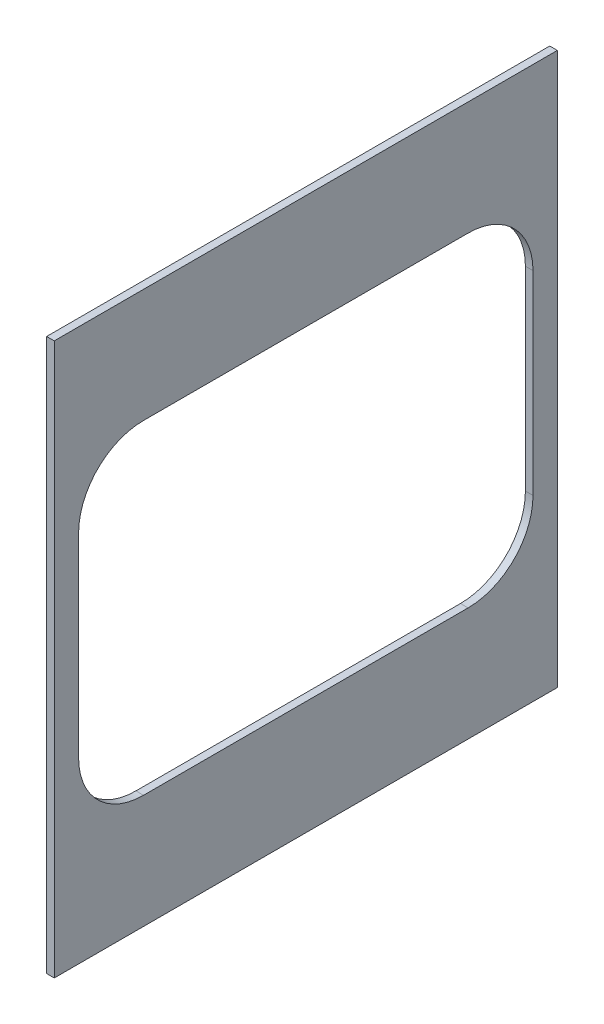
ISO-10303-21;
HEADER;
FILE_DESCRIPTION(('STEP AP214'),'2;1');
FILE_NAME('part.step','',(''),(''),'','','');
FILE_SCHEMA(('AUTOMOTIVE_DESIGN { 1 0 10303 214 1 1 1 1 }'));
ENDSEC;
DATA;
#1=APPLICATION_CONTEXT('core data for automotive mechanical design processes');
#2=APPLICATION_PROTOCOL_DEFINITION('international standard','automotive_design',2000,#1);
#3=PRODUCT_CONTEXT('',#1,'mechanical');
#4=PRODUCT('Part','Part','',(#3));
#5=PRODUCT_RELATED_PRODUCT_CATEGORY('part','',(#4));
#6=PRODUCT_DEFINITION_FORMATION('','',#4);
#7=PRODUCT_DEFINITION_CONTEXT('part definition',#1,'design');
#8=PRODUCT_DEFINITION('design','',#6,#7);
#9=PRODUCT_DEFINITION_SHAPE('','',#8);
#10=(LENGTH_UNIT() NAMED_UNIT(*) SI_UNIT(.MILLI.,.METRE.));
#11=(NAMED_UNIT(*) PLANE_ANGLE_UNIT() SI_UNIT($,.RADIAN.));
#12=(NAMED_UNIT(*) SI_UNIT($,.STERADIAN.) SOLID_ANGLE_UNIT());
#13=UNCERTAINTY_MEASURE_WITH_UNIT(LENGTH_MEASURE(1.E-05),#10,'distance_accuracy_value','');
#14=(GEOMETRIC_REPRESENTATION_CONTEXT(3) GLOBAL_UNCERTAINTY_ASSIGNED_CONTEXT((#13)) GLOBAL_UNIT_ASSIGNED_CONTEXT((#10,
#11,#12)) REPRESENTATION_CONTEXT('',''));
#15=CARTESIAN_POINT('',(0.,0.,0.));
#16=DIRECTION('',(0.,0.,1.));
#17=DIRECTION('',(1.,0.,0.));
#18=AXIS2_PLACEMENT_3D('',#15,#16,#17);
#19=CARTESIAN_POINT('',(11.90625,0.,0.));
#20=DIRECTION('',(-1.,0.,0.));
#21=DIRECTION('',(0.,0.,1.));
#22=AXIS2_PLACEMENT_3D('',#19,#20,#21);
#23=PLANE('',#22);
#24=DIRECTION('',(0.,-1.,0.));
#25=VECTOR('',#24,1.);
#26=CARTESIAN_POINT('',(11.90625,0.,0.));
#27=LINE('',#26,#25);
#28=CARTESIAN_POINT('',(11.90625,863.6,0.));
#29=VERTEX_POINT('',#28);
#30=CARTESIAN_POINT('',(11.90625,0.,0.));
#31=VERTEX_POINT('',#30);
#32=EDGE_CURVE('E194',#29,#31,#27,.T.);
#33=ORIENTED_EDGE('',*,*,#32,.T.);
#34=DIRECTION('',(0.,0.,-1.));
#35=VECTOR('',#34,1.);
#36=CARTESIAN_POINT('',(11.90625,0.,0.));
#37=LINE('',#36,#35);
#38=CARTESIAN_POINT('',(11.90625,0.,-787.4));
#39=VERTEX_POINT('',#38);
#40=EDGE_CURVE('E197',#31,#39,#37,.T.);
#41=ORIENTED_EDGE('',*,*,#40,.T.);
#42=DIRECTION('',(0.,1.,0.));
#43=VECTOR('',#42,1.);
#44=CARTESIAN_POINT('',(11.90625,0.,-787.4));
#45=LINE('',#44,#43);
#46=CARTESIAN_POINT('',(11.90625,863.6,-787.4));
#47=VERTEX_POINT('',#46);
#48=EDGE_CURVE('E200',#39,#47,#45,.T.);
#49=ORIENTED_EDGE('',*,*,#48,.T.);
#50=DIRECTION('',(0.,0.,1.));
#51=VECTOR('',#50,1.);
#52=CARTESIAN_POINT('',(11.90625,863.6,0.));
#53=LINE('',#52,#51);
#54=EDGE_CURVE('E202',#47,#29,#53,.T.);
#55=ORIENTED_EDGE('',*,*,#54,.T.);
#56=EDGE_LOOP('',(#33,#41,#49,#55));
#57=FACE_BOUND('',#56,.T.);
#58=CARTESIAN_POINT('',(11.90625,279.4,-139.7));
#59=DIRECTION('',(1.,0.,0.));
#60=DIRECTION('',(0.,0.,-1.));
#61=AXIS2_PLACEMENT_3D('',#58,#59,#60);
#62=CIRCLE('',#61,101.6);
#63=CARTESIAN_POINT('',(11.90625,279.4,-38.1000000000001));
#64=VERTEX_POINT('',#63);
#65=CARTESIAN_POINT('',(11.90625,177.8,-139.7));
#66=VERTEX_POINT('',#65);
#67=EDGE_CURVE('E129',#64,#66,#62,.T.);
#68=ORIENTED_EDGE('',*,*,#67,.F.);
#69=DIRECTION('',(0.,-1.,0.));
#70=VECTOR('',#69,1.);
#71=CARTESIAN_POINT('',(11.90625,584.2,-38.1000000000001));
#72=LINE('',#71,#70);
#73=CARTESIAN_POINT('',(11.90625,584.2,-38.1000000000001));
#74=VERTEX_POINT('',#73);
#75=EDGE_CURVE('E162',#74,#64,#72,.T.);
#76=ORIENTED_EDGE('',*,*,#75,.F.);
#77=CARTESIAN_POINT('',(11.90625,584.2,-139.7));
#78=DIRECTION('',(1.,0.,0.));
#79=DIRECTION('',(0.,0.,-1.));
#80=AXIS2_PLACEMENT_3D('',#77,#78,#79);
#81=CIRCLE('',#80,101.6);
#82=CARTESIAN_POINT('',(11.90625,685.8,-139.7));
#83=VERTEX_POINT('',#82);
#84=EDGE_CURVE('E160',#83,#74,#81,.T.);
#85=ORIENTED_EDGE('',*,*,#84,.F.);
#86=DIRECTION('',(0.,0.,1.));
#87=VECTOR('',#86,1.);
#88=CARTESIAN_POINT('',(11.90625,685.8,-139.7));
#89=LINE('',#88,#87);
#90=CARTESIAN_POINT('',(11.90625,685.8,-647.7));
#91=VERTEX_POINT('',#90);
#92=EDGE_CURVE('E158',#91,#83,#89,.T.);
#93=ORIENTED_EDGE('',*,*,#92,.F.);
#94=CARTESIAN_POINT('',(11.90625,584.2,-647.7));
#95=DIRECTION('',(1.,0.,0.));
#96=DIRECTION('',(0.,0.,1.));
#97=AXIS2_PLACEMENT_3D('',#94,#95,#96);
#98=CIRCLE('',#97,101.6);
#99=CARTESIAN_POINT('',(11.90625,584.2,-749.3));
#100=VERTEX_POINT('',#99);
#101=EDGE_CURVE('E156',#100,#91,#98,.T.);
#102=ORIENTED_EDGE('',*,*,#101,.F.);
#103=DIRECTION('',(0.,1.,0.));
#104=VECTOR('',#103,1.);
#105=CARTESIAN_POINT('',(11.90625,584.2,-749.3));
#106=LINE('',#105,#104);
#107=CARTESIAN_POINT('',(11.90625,279.4,-749.3));
#108=VERTEX_POINT('',#107);
#109=EDGE_CURVE('E152',#108,#100,#106,.T.);
#110=ORIENTED_EDGE('',*,*,#109,.F.);
#111=CARTESIAN_POINT('',(11.90625,279.4,-647.7));
#112=DIRECTION('',(1.,0.,0.));
#113=DIRECTION('',(0.,0.,-1.));
#114=AXIS2_PLACEMENT_3D('',#111,#112,#113);
#115=CIRCLE('',#114,101.6);
#116=CARTESIAN_POINT('',(11.90625,177.8,-647.7));
#117=VERTEX_POINT('',#116);
#118=EDGE_CURVE('E150',#117,#108,#115,.T.);
#119=ORIENTED_EDGE('',*,*,#118,.F.);
#120=DIRECTION('',(0.,0.,-1.));
#121=VECTOR('',#120,1.);
#122=CARTESIAN_POINT('',(11.90625,177.8,-139.7));
#123=LINE('',#122,#121);
#124=EDGE_CURVE('E137',#66,#117,#123,.T.);
#125=ORIENTED_EDGE('',*,*,#124,.F.);
#126=EDGE_LOOP('',(#68,#76,#85,#93,#102,#110,#119,#125));
#127=FACE_BOUND('',#126,.T.);
#128=ADVANCED_FACE('F40',(#57,#127),#23,.F.);
#129=CARTESIAN_POINT('',(0.,0.,0.));
#130=DIRECTION('',(-1.,0.,0.));
#131=DIRECTION('',(0.,0.,1.));
#132=AXIS2_PLACEMENT_3D('',#129,#130,#131);
#133=PLANE('',#132);
#134=DIRECTION('',(0.,-1.,0.));
#135=VECTOR('',#134,1.);
#136=CARTESIAN_POINT('',(0.,0.,0.));
#137=LINE('',#136,#135);
#138=CARTESIAN_POINT('',(0.,863.6,0.));
#139=VERTEX_POINT('',#138);
#140=CARTESIAN_POINT('',(0.,0.,0.));
#141=VERTEX_POINT('',#140);
#142=EDGE_CURVE('E145',#139,#141,#137,.T.);
#143=ORIENTED_EDGE('',*,*,#142,.F.);
#144=DIRECTION('',(0.,0.,1.));
#145=VECTOR('',#144,1.);
#146=CARTESIAN_POINT('',(0.,863.6,0.));
#147=LINE('',#146,#145);
#148=CARTESIAN_POINT('',(0.,863.6,-787.4));
#149=VERTEX_POINT('',#148);
#150=EDGE_CURVE('E198',#149,#139,#147,.T.);
#151=ORIENTED_EDGE('',*,*,#150,.F.);
#152=DIRECTION('',(0.,1.,0.));
#153=VECTOR('',#152,1.);
#154=CARTESIAN_POINT('',(0.,0.,-787.4));
#155=LINE('',#154,#153);
#156=CARTESIAN_POINT('',(0.,0.,-787.4));
#157=VERTEX_POINT('',#156);
#158=EDGE_CURVE('E209',#157,#149,#155,.T.);
#159=ORIENTED_EDGE('',*,*,#158,.F.);
#160=DIRECTION('',(0.,0.,-1.));
#161=VECTOR('',#160,1.);
#162=CARTESIAN_POINT('',(0.,0.,0.));
#163=LINE('',#162,#161);
#164=EDGE_CURVE('E207',#141,#157,#163,.T.);
#165=ORIENTED_EDGE('',*,*,#164,.F.);
#166=EDGE_LOOP('',(#143,#151,#159,#165));
#167=FACE_BOUND('',#166,.T.);
#168=DIRECTION('',(0.,-1.,0.));
#169=VECTOR('',#168,1.);
#170=CARTESIAN_POINT('',(0.,584.2,-38.1000000000001));
#171=LINE('',#170,#169);
#172=CARTESIAN_POINT('',(0.,584.2,-38.1000000000001));
#173=VERTEX_POINT('',#172);
#174=CARTESIAN_POINT('',(0.,279.4,-38.1000000000001));
#175=VERTEX_POINT('',#174);
#176=EDGE_CURVE('E138',#173,#175,#171,.T.);
#177=ORIENTED_EDGE('',*,*,#176,.T.);
#178=CARTESIAN_POINT('',(0.,279.4,-139.7));
#179=DIRECTION('',(1.,0.,0.));
#180=DIRECTION('',(0.,0.,-1.));
#181=AXIS2_PLACEMENT_3D('',#178,#179,#180);
#182=CIRCLE('',#181,101.6);
#183=CARTESIAN_POINT('',(0.,177.8,-139.7));
#184=VERTEX_POINT('',#183);
#185=EDGE_CURVE('E63',#175,#184,#182,.T.);
#186=ORIENTED_EDGE('',*,*,#185,.T.);
#187=DIRECTION('',(0.,0.,-1.));
#188=VECTOR('',#187,1.);
#189=CARTESIAN_POINT('',(0.,177.8,-139.7));
#190=LINE('',#189,#188);
#191=CARTESIAN_POINT('',(0.,177.8,-647.7));
#192=VERTEX_POINT('',#191);
#193=EDGE_CURVE('E144',#184,#192,#190,.T.);
#194=ORIENTED_EDGE('',*,*,#193,.T.);
#195=CARTESIAN_POINT('',(0.,279.4,-647.7));
#196=DIRECTION('',(1.,0.,0.));
#197=DIRECTION('',(0.,0.,-1.));
#198=AXIS2_PLACEMENT_3D('',#195,#196,#197);
#199=CIRCLE('',#198,101.6);
#200=CARTESIAN_POINT('',(0.,279.4,-749.3));
#201=VERTEX_POINT('',#200);
#202=EDGE_CURVE('E166',#192,#201,#199,.T.);
#203=ORIENTED_EDGE('',*,*,#202,.T.);
#204=DIRECTION('',(0.,1.,0.));
#205=VECTOR('',#204,1.);
#206=CARTESIAN_POINT('',(0.,584.2,-749.3));
#207=LINE('',#206,#205);
#208=CARTESIAN_POINT('',(0.,584.2,-749.3));
#209=VERTEX_POINT('',#208);
#210=EDGE_CURVE('E169',#201,#209,#207,.T.);
#211=ORIENTED_EDGE('',*,*,#210,.T.);
#212=CARTESIAN_POINT('',(0.,584.2,-647.7));
#213=DIRECTION('',(1.,0.,0.));
#214=DIRECTION('',(0.,0.,1.));
#215=AXIS2_PLACEMENT_3D('',#212,#213,#214);
#216=CIRCLE('',#215,101.6);
#217=CARTESIAN_POINT('',(0.,685.8,-647.7));
#218=VERTEX_POINT('',#217);
#219=EDGE_CURVE('E172',#209,#218,#216,.T.);
#220=ORIENTED_EDGE('',*,*,#219,.T.);
#221=DIRECTION('',(0.,0.,1.));
#222=VECTOR('',#221,1.);
#223=CARTESIAN_POINT('',(0.,685.8,-139.7));
#224=LINE('',#223,#222);
#225=CARTESIAN_POINT('',(0.,685.8,-139.7));
#226=VERTEX_POINT('',#225);
#227=EDGE_CURVE('E175',#218,#226,#224,.T.);
#228=ORIENTED_EDGE('',*,*,#227,.T.);
#229=CARTESIAN_POINT('',(0.,584.2,-139.7));
#230=DIRECTION('',(1.,0.,0.));
#231=DIRECTION('',(0.,0.,-1.));
#232=AXIS2_PLACEMENT_3D('',#229,#230,#231);
#233=CIRCLE('',#232,101.6);
#234=EDGE_CURVE('E178',#226,#173,#233,.T.);
#235=ORIENTED_EDGE('',*,*,#234,.T.);
#236=EDGE_LOOP('',(#177,#186,#194,#203,#211,#220,#228,#235));
#237=FACE_BOUND('',#236,.T.);
#238=ADVANCED_FACE('F227',(#167,#237),#133,.T.);
#239=CARTESIAN_POINT('',(11.90625,0.,0.));
#240=DIRECTION('',(0.,0.,-1.));
#241=DIRECTION('',(-1.,0.,0.));
#242=AXIS2_PLACEMENT_3D('',#239,#240,#241);
#243=PLANE('',#242);
#244=ORIENTED_EDGE('',*,*,#142,.T.);
#245=DIRECTION('',(-1.,0.,0.));
#246=VECTOR('',#245,1.);
#247=CARTESIAN_POINT('',(11.90625,0.,0.));
#248=LINE('',#247,#246);
#249=EDGE_CURVE('E11',#31,#141,#248,.T.);
#250=ORIENTED_EDGE('',*,*,#249,.F.);
#251=ORIENTED_EDGE('',*,*,#32,.F.);
#252=DIRECTION('',(-1.,0.,0.));
#253=VECTOR('',#252,1.);
#254=CARTESIAN_POINT('',(11.90625,863.6,0.));
#255=LINE('',#254,#253);
#256=EDGE_CURVE('E204',#29,#139,#255,.T.);
#257=ORIENTED_EDGE('',*,*,#256,.T.);
#258=EDGE_LOOP('',(#244,#250,#251,#257));
#259=FACE_BOUND('',#258,.T.);
#260=ADVANCED_FACE('F42',(#259),#243,.F.);
#261=CARTESIAN_POINT('',(11.90625,0.,0.));
#262=DIRECTION('',(0.,1.,0.));
#263=DIRECTION('',(0.,0.,1.));
#264=AXIS2_PLACEMENT_3D('',#261,#262,#263);
#265=PLANE('',#264);
#266=ORIENTED_EDGE('',*,*,#164,.T.);
#267=DIRECTION('',(-1.,0.,0.));
#268=VECTOR('',#267,1.);
#269=CARTESIAN_POINT('',(11.90625,0.,-787.4));
#270=LINE('',#269,#268);
#271=EDGE_CURVE('E48',#39,#157,#270,.T.);
#272=ORIENTED_EDGE('',*,*,#271,.F.);
#273=ORIENTED_EDGE('',*,*,#40,.F.);
#274=ORIENTED_EDGE('',*,*,#249,.T.);
#275=EDGE_LOOP('',(#266,#272,#273,#274));
#276=FACE_BOUND('',#275,.T.);
#277=ADVANCED_FACE('F237',(#276),#265,.F.);
#278=CARTESIAN_POINT('',(11.90625,0.,-787.4));
#279=DIRECTION('',(0.,0.,1.));
#280=DIRECTION('',(1.,0.,0.));
#281=AXIS2_PLACEMENT_3D('',#278,#279,#280);
#282=PLANE('',#281);
#283=ORIENTED_EDGE('',*,*,#158,.T.);
#284=DIRECTION('',(-1.,0.,0.));
#285=VECTOR('',#284,1.);
#286=CARTESIAN_POINT('',(11.90625,863.6,-787.4));
#287=LINE('',#286,#285);
#288=EDGE_CURVE('E214',#47,#149,#287,.T.);
#289=ORIENTED_EDGE('',*,*,#288,.F.);
#290=ORIENTED_EDGE('',*,*,#48,.F.);
#291=ORIENTED_EDGE('',*,*,#271,.T.);
#292=EDGE_LOOP('',(#283,#289,#290,#291));
#293=FACE_BOUND('',#292,.T.);
#294=ADVANCED_FACE('F221',(#293),#282,.F.);
#295=CARTESIAN_POINT('',(11.90625,863.6,0.));
#296=DIRECTION('',(0.,-1.,0.));
#297=DIRECTION('',(0.,0.,-1.));
#298=AXIS2_PLACEMENT_3D('',#295,#296,#297);
#299=PLANE('',#298);
#300=ORIENTED_EDGE('',*,*,#150,.T.);
#301=ORIENTED_EDGE('',*,*,#256,.F.);
#302=ORIENTED_EDGE('',*,*,#54,.F.);
#303=ORIENTED_EDGE('',*,*,#288,.T.);
#304=EDGE_LOOP('',(#300,#301,#302,#303));
#305=FACE_BOUND('',#304,.T.);
#306=ADVANCED_FACE('F231',(#305),#299,.F.);
#307=CARTESIAN_POINT('',(11.90625,279.4,-139.7));
#308=DIRECTION('',(-1.,0.,0.));
#309=DIRECTION('',(0.,0.,1.));
#310=AXIS2_PLACEMENT_3D('',#307,#308,#309);
#311=CYLINDRICAL_SURFACE('',#310,101.6);
#312=ORIENTED_EDGE('',*,*,#185,.F.);
#313=DIRECTION('',(-1.,0.,0.));
#314=VECTOR('',#313,1.);
#315=CARTESIAN_POINT('',(11.90625,279.4,-38.1000000000001));
#316=LINE('',#315,#314);
#317=EDGE_CURVE('E133',#64,#175,#316,.T.);
#318=ORIENTED_EDGE('',*,*,#317,.F.);
#319=ORIENTED_EDGE('',*,*,#67,.T.);
#320=DIRECTION('',(-1.,0.,0.));
#321=VECTOR('',#320,1.);
#322=CARTESIAN_POINT('',(11.90625,177.8,-139.7));
#323=LINE('',#322,#321);
#324=EDGE_CURVE('E132',#66,#184,#323,.T.);
#325=ORIENTED_EDGE('',*,*,#324,.T.);
#326=EDGE_LOOP('',(#312,#318,#319,#325));
#327=FACE_BOUND('',#326,.T.);
#328=ADVANCED_FACE('F131',(#327),#311,.F.);
#329=CARTESIAN_POINT('',(11.90625,177.8,-139.7));
#330=DIRECTION('',(0.,1.,0.));
#331=DIRECTION('',(0.,0.,1.));
#332=AXIS2_PLACEMENT_3D('',#329,#330,#331);
#333=PLANE('',#332);
#334=ORIENTED_EDGE('',*,*,#193,.F.);
#335=ORIENTED_EDGE('',*,*,#324,.F.);
#336=ORIENTED_EDGE('',*,*,#124,.T.);
#337=DIRECTION('',(-1.,0.,0.));
#338=VECTOR('',#337,1.);
#339=CARTESIAN_POINT('',(11.90625,177.8,-647.7));
#340=LINE('',#339,#338);
#341=EDGE_CURVE('E146',#117,#192,#340,.T.);
#342=ORIENTED_EDGE('',*,*,#341,.T.);
#343=EDGE_LOOP('',(#334,#335,#336,#342));
#344=FACE_BOUND('',#343,.T.);
#345=ADVANCED_FACE('F141',(#344),#333,.T.);
#346=CARTESIAN_POINT('',(11.90625,279.4,-647.7));
#347=DIRECTION('',(-1.,0.,0.));
#348=DIRECTION('',(0.,0.,1.));
#349=AXIS2_PLACEMENT_3D('',#346,#347,#348);
#350=CYLINDRICAL_SURFACE('',#349,101.6);
#351=ORIENTED_EDGE('',*,*,#202,.F.);
#352=ORIENTED_EDGE('',*,*,#341,.F.);
#353=ORIENTED_EDGE('',*,*,#118,.T.);
#354=DIRECTION('',(-1.,0.,0.));
#355=VECTOR('',#354,1.);
#356=CARTESIAN_POINT('',(11.90625,279.4,-749.3));
#357=LINE('',#356,#355);
#358=EDGE_CURVE('E191',#108,#201,#357,.T.);
#359=ORIENTED_EDGE('',*,*,#358,.T.);
#360=EDGE_LOOP('',(#351,#352,#353,#359));
#361=FACE_BOUND('',#360,.T.);
#362=ADVANCED_FACE('F260',(#361),#350,.F.);
#363=CARTESIAN_POINT('',(11.90625,584.2,-749.3));
#364=DIRECTION('',(0.,0.,1.));
#365=DIRECTION('',(1.,0.,0.));
#366=AXIS2_PLACEMENT_3D('',#363,#364,#365);
#367=PLANE('',#366);
#368=ORIENTED_EDGE('',*,*,#210,.F.);
#369=ORIENTED_EDGE('',*,*,#358,.F.);
#370=ORIENTED_EDGE('',*,*,#109,.T.);
#371=DIRECTION('',(-1.,0.,0.));
#372=VECTOR('',#371,1.);
#373=CARTESIAN_POINT('',(11.90625,584.2,-749.3));
#374=LINE('',#373,#372);
#375=EDGE_CURVE('E189',#100,#209,#374,.T.);
#376=ORIENTED_EDGE('',*,*,#375,.T.);
#377=EDGE_LOOP('',(#368,#369,#370,#376));
#378=FACE_BOUND('',#377,.T.);
#379=ADVANCED_FACE('F264',(#378),#367,.T.);
#380=CARTESIAN_POINT('',(11.90625,584.2,-647.7));
#381=DIRECTION('',(-1.,0.,0.));
#382=DIRECTION('',(0.,0.,1.));
#383=AXIS2_PLACEMENT_3D('',#380,#381,#382);
#384=CYLINDRICAL_SURFACE('',#383,101.6);
#385=ORIENTED_EDGE('',*,*,#219,.F.);
#386=ORIENTED_EDGE('',*,*,#375,.F.);
#387=ORIENTED_EDGE('',*,*,#101,.T.);
#388=DIRECTION('',(-1.,0.,0.));
#389=VECTOR('',#388,1.);
#390=CARTESIAN_POINT('',(11.90625,685.8,-647.7));
#391=LINE('',#390,#389);
#392=EDGE_CURVE('E187',#91,#218,#391,.T.);
#393=ORIENTED_EDGE('',*,*,#392,.T.);
#394=EDGE_LOOP('',(#385,#386,#387,#393));
#395=FACE_BOUND('',#394,.T.);
#396=ADVANCED_FACE('F270',(#395),#384,.F.);
#397=CARTESIAN_POINT('',(11.90625,685.8,-139.7));
#398=DIRECTION('',(0.,-1.,0.));
#399=DIRECTION('',(0.,0.,-1.));
#400=AXIS2_PLACEMENT_3D('',#397,#398,#399);
#401=PLANE('',#400);
#402=ORIENTED_EDGE('',*,*,#227,.F.);
#403=ORIENTED_EDGE('',*,*,#392,.F.);
#404=ORIENTED_EDGE('',*,*,#92,.T.);
#405=DIRECTION('',(-1.,0.,0.));
#406=VECTOR('',#405,1.);
#407=CARTESIAN_POINT('',(11.90625,685.8,-139.7));
#408=LINE('',#407,#406);
#409=EDGE_CURVE('E185',#83,#226,#408,.T.);
#410=ORIENTED_EDGE('',*,*,#409,.T.);
#411=EDGE_LOOP('',(#402,#403,#404,#410));
#412=FACE_BOUND('',#411,.T.);
#413=ADVANCED_FACE('F274',(#412),#401,.T.);
#414=CARTESIAN_POINT('',(11.90625,584.2,-139.7));
#415=DIRECTION('',(-1.,0.,0.));
#416=DIRECTION('',(0.,0.,1.));
#417=AXIS2_PLACEMENT_3D('',#414,#415,#416);
#418=CYLINDRICAL_SURFACE('',#417,101.6);
#419=ORIENTED_EDGE('',*,*,#234,.F.);
#420=ORIENTED_EDGE('',*,*,#409,.F.);
#421=ORIENTED_EDGE('',*,*,#84,.T.);
#422=DIRECTION('',(-1.,0.,0.));
#423=VECTOR('',#422,1.);
#424=CARTESIAN_POINT('',(11.90625,584.2,-38.1000000000001));
#425=LINE('',#424,#423);
#426=EDGE_CURVE('E55',#74,#173,#425,.T.);
#427=ORIENTED_EDGE('',*,*,#426,.T.);
#428=EDGE_LOOP('',(#419,#420,#421,#427));
#429=FACE_BOUND('',#428,.T.);
#430=ADVANCED_FACE('F278',(#429),#418,.F.);
#431=CARTESIAN_POINT('',(11.90625,584.2,-38.1000000000001));
#432=DIRECTION('',(0.,0.,-1.));
#433=DIRECTION('',(-1.,0.,0.));
#434=AXIS2_PLACEMENT_3D('',#431,#432,#433);
#435=PLANE('',#434);
#436=ORIENTED_EDGE('',*,*,#176,.F.);
#437=ORIENTED_EDGE('',*,*,#426,.F.);
#438=ORIENTED_EDGE('',*,*,#75,.T.);
#439=ORIENTED_EDGE('',*,*,#317,.T.);
#440=EDGE_LOOP('',(#436,#437,#438,#439));
#441=FACE_BOUND('',#440,.T.);
#442=ADVANCED_FACE('F282',(#441),#435,.T.);
#443=CLOSED_SHELL('',(#128,#238,#260,#277,#294,#306,#328,#345,#362,#379,#396,#413,#430,#442));
#444=MANIFOLD_SOLID_BREP('B2',#443);
#445=ADVANCED_BREP_SHAPE_REPRESENTATION('',(#18,#444),#14);
#446=SHAPE_DEFINITION_REPRESENTATION(#9,#445);
ENDSEC;
END-ISO-10303-21;
